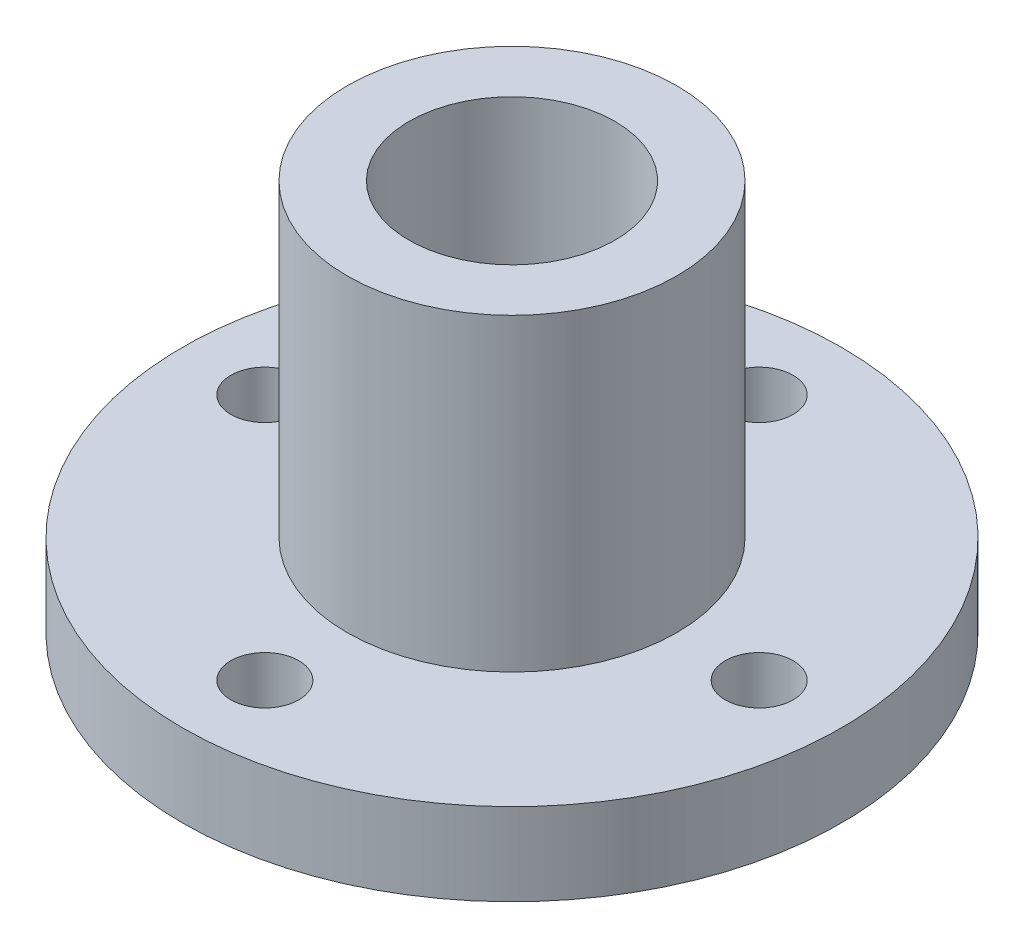
ISO-10303-21;
HEADER;
FILE_DESCRIPTION(('STEP AP214'),'2;1');
FILE_NAME('part.step','',(''),(''),'','','');
FILE_SCHEMA(('AUTOMOTIVE_DESIGN { 1 0 10303 214 1 1 1 1 }'));
ENDSEC;
DATA;
#1=APPLICATION_CONTEXT('core data for automotive mechanical design processes');
#2=APPLICATION_PROTOCOL_DEFINITION('international standard','automotive_design',2000,#1);
#3=PRODUCT_CONTEXT('',#1,'mechanical');
#4=PRODUCT('Part','Part','',(#3));
#5=PRODUCT_RELATED_PRODUCT_CATEGORY('part','',(#4));
#6=PRODUCT_DEFINITION_FORMATION('','',#4);
#7=PRODUCT_DEFINITION_CONTEXT('part definition',#1,'design');
#8=PRODUCT_DEFINITION('design','',#6,#7);
#9=PRODUCT_DEFINITION_SHAPE('','',#8);
#10=(LENGTH_UNIT() NAMED_UNIT(*) SI_UNIT(.MILLI.,.METRE.));
#11=(NAMED_UNIT(*) PLANE_ANGLE_UNIT() SI_UNIT($,.RADIAN.));
#12=(NAMED_UNIT(*) SI_UNIT($,.STERADIAN.) SOLID_ANGLE_UNIT());
#13=UNCERTAINTY_MEASURE_WITH_UNIT(LENGTH_MEASURE(1.E-05),#10,'distance_accuracy_value','');
#14=(GEOMETRIC_REPRESENTATION_CONTEXT(3) GLOBAL_UNCERTAINTY_ASSIGNED_CONTEXT((#13)) GLOBAL_UNIT_ASSIGNED_CONTEXT((#10,
#11,#12)) REPRESENTATION_CONTEXT('',''));
#15=CARTESIAN_POINT('',(0.,0.,0.));
#16=DIRECTION('',(0.,0.,1.));
#17=DIRECTION('',(1.,0.,0.));
#18=AXIS2_PLACEMENT_3D('',#15,#16,#17);
#19=CARTESIAN_POINT('',(-16.,0.,0.));
#20=DIRECTION('',(0.,1.,0.));
#21=DIRECTION('',(0.,0.,1.));
#22=AXIS2_PLACEMENT_3D('',#19,#20,#21);
#23=PLANE('',#22);
#24=CARTESIAN_POINT('',(12.,0.,0.));
#25=DIRECTION('',(0.,-1.,0.));
#26=DIRECTION('',(0.,0.,-1.));
#27=AXIS2_PLACEMENT_3D('',#24,#25,#26);
#28=CIRCLE('',#27,1.65);
#29=CARTESIAN_POINT('',(12.,0.,-1.65));
#30=VERTEX_POINT('',#29);
#31=EDGE_CURVE('E76',#30,#30,#28,.T.);
#32=ORIENTED_EDGE('',*,*,#31,.F.);
#33=EDGE_LOOP('',(#32));
#34=FACE_BOUND('',#33,.T.);
#35=CARTESIAN_POINT('',(0.,0.,-12.));
#36=DIRECTION('',(0.,-1.,0.));
#37=DIRECTION('',(0.,0.,-1.));
#38=AXIS2_PLACEMENT_3D('',#35,#36,#37);
#39=CIRCLE('',#38,1.65);
#40=CARTESIAN_POINT('',(0.,0.,-13.65));
#41=VERTEX_POINT('',#40);
#42=EDGE_CURVE('E63',#41,#41,#39,.T.);
#43=ORIENTED_EDGE('',*,*,#42,.F.);
#44=EDGE_LOOP('',(#43));
#45=FACE_BOUND('',#44,.T.);
#46=CARTESIAN_POINT('',(-12.,0.,0.));
#47=DIRECTION('',(0.,-1.,0.));
#48=DIRECTION('',(0.,0.,-1.));
#49=AXIS2_PLACEMENT_3D('',#46,#47,#48);
#50=CIRCLE('',#49,1.65);
#51=CARTESIAN_POINT('',(-12.,0.,-1.65));
#52=VERTEX_POINT('',#51);
#53=EDGE_CURVE('E59',#52,#52,#50,.T.);
#54=ORIENTED_EDGE('',*,*,#53,.F.);
#55=EDGE_LOOP('',(#54));
#56=FACE_BOUND('',#55,.T.);
#57=CARTESIAN_POINT('',(0.,0.,12.));
#58=DIRECTION('',(0.,-1.,0.));
#59=DIRECTION('',(0.,0.,-1.));
#60=AXIS2_PLACEMENT_3D('',#57,#58,#59);
#61=CIRCLE('',#60,1.65);
#62=CARTESIAN_POINT('',(0.,0.,10.35));
#63=VERTEX_POINT('',#62);
#64=EDGE_CURVE('E58',#63,#63,#61,.T.);
#65=ORIENTED_EDGE('',*,*,#64,.F.);
#66=EDGE_LOOP('',(#65));
#67=FACE_BOUND('',#66,.T.);
#68=CARTESIAN_POINT('',(0.,0.,0.));
#69=DIRECTION('',(0.,-1.,0.));
#70=DIRECTION('',(0.,0.,-1.));
#71=AXIS2_PLACEMENT_3D('',#68,#69,#70);
#72=CIRCLE('',#71,5.);
#73=CARTESIAN_POINT('',(0.,0.,-5.));
#74=VERTEX_POINT('',#73);
#75=EDGE_CURVE('E10',#74,#74,#72,.T.);
#76=ORIENTED_EDGE('',*,*,#75,.F.);
#77=EDGE_LOOP('',(#76));
#78=FACE_BOUND('',#77,.T.);
#79=CARTESIAN_POINT('',(0.,0.,0.));
#80=DIRECTION('',(0.,-1.,0.));
#81=DIRECTION('',(0.,0.,-1.));
#82=AXIS2_PLACEMENT_3D('',#79,#80,#81);
#83=CIRCLE('',#82,16.);
#84=CARTESIAN_POINT('',(0.,0.,-16.));
#85=VERTEX_POINT('',#84);
#86=EDGE_CURVE('E86',#85,#85,#83,.T.);
#87=ORIENTED_EDGE('',*,*,#86,.T.);
#88=EDGE_LOOP('',(#87));
#89=FACE_BOUND('',#88,.T.);
#90=ADVANCED_FACE('F37',(#34,#45,#56,#67,#78,#89),#23,.F.);
#91=CARTESIAN_POINT('',(0.,0.,0.));
#92=DIRECTION('',(0.,-1.,0.));
#93=DIRECTION('',(0.,0.,-1.));
#94=AXIS2_PLACEMENT_3D('',#91,#92,#93);
#95=CYLINDRICAL_SURFACE('',#94,5.);
#96=CARTESIAN_POINT('',(0.,19.,0.));
#97=DIRECTION('',(0.,-1.,0.));
#98=DIRECTION('',(0.,0.,-1.));
#99=AXIS2_PLACEMENT_3D('',#96,#97,#98);
#100=CIRCLE('',#99,5.);
#101=CARTESIAN_POINT('',(0.,19.,-5.));
#102=VERTEX_POINT('',#101);
#103=EDGE_CURVE('E45',#102,#102,#100,.T.);
#104=ORIENTED_EDGE('',*,*,#103,.F.);
#105=EDGE_LOOP('',(#104));
#106=FACE_BOUND('',#105,.T.);
#107=ORIENTED_EDGE('',*,*,#75,.T.);
#108=EDGE_LOOP('',(#107));
#109=FACE_BOUND('',#108,.T.);
#110=ADVANCED_FACE('F106',(#106,#109),#95,.F.);
#111=CARTESIAN_POINT('',(-5.,19.,0.));
#112=DIRECTION('',(0.,-1.,0.));
#113=DIRECTION('',(0.,0.,-1.));
#114=AXIS2_PLACEMENT_3D('',#111,#112,#113);
#115=PLANE('',#114);
#116=CARTESIAN_POINT('',(0.,19.,0.));
#117=DIRECTION('',(0.,-1.,0.));
#118=DIRECTION('',(0.,0.,-1.));
#119=AXIS2_PLACEMENT_3D('',#116,#117,#118);
#120=CIRCLE('',#119,8.);
#121=CARTESIAN_POINT('',(0.,19.,-8.));
#122=VERTEX_POINT('',#121);
#123=EDGE_CURVE('E51',#122,#122,#120,.T.);
#124=ORIENTED_EDGE('',*,*,#123,.F.);
#125=EDGE_LOOP('',(#124));
#126=FACE_BOUND('',#125,.T.);
#127=ORIENTED_EDGE('',*,*,#103,.T.);
#128=EDGE_LOOP('',(#127));
#129=FACE_BOUND('',#128,.T.);
#130=ADVANCED_FACE('F103',(#126,#129),#115,.F.);
#131=CARTESIAN_POINT('',(0.,0.,0.));
#132=DIRECTION('',(0.,-1.,0.));
#133=DIRECTION('',(0.,0.,-1.));
#134=AXIS2_PLACEMENT_3D('',#131,#132,#133);
#135=CYLINDRICAL_SURFACE('',#134,8.);
#136=CARTESIAN_POINT('',(0.,4.,0.));
#137=DIRECTION('',(0.,-1.,0.));
#138=DIRECTION('',(0.,0.,-1.));
#139=AXIS2_PLACEMENT_3D('',#136,#137,#138);
#140=CIRCLE('',#139,8.);
#141=CARTESIAN_POINT('',(0.,4.,-8.));
#142=VERTEX_POINT('',#141);
#143=EDGE_CURVE('E94',#142,#142,#140,.T.);
#144=ORIENTED_EDGE('',*,*,#143,.F.);
#145=EDGE_LOOP('',(#144));
#146=FACE_BOUND('',#145,.T.);
#147=ORIENTED_EDGE('',*,*,#123,.T.);
#148=EDGE_LOOP('',(#147));
#149=FACE_BOUND('',#148,.T.);
#150=ADVANCED_FACE('F101',(#146,#149),#135,.T.);
#151=CARTESIAN_POINT('',(-8.,4.,0.));
#152=DIRECTION('',(0.,-1.,0.));
#153=DIRECTION('',(0.,0.,-1.));
#154=AXIS2_PLACEMENT_3D('',#151,#152,#153);
#155=PLANE('',#154);
#156=CARTESIAN_POINT('',(12.,4.,0.));
#157=DIRECTION('',(0.,-1.,0.));
#158=DIRECTION('',(0.,0.,-1.));
#159=AXIS2_PLACEMENT_3D('',#156,#157,#158);
#160=CIRCLE('',#159,1.65);
#161=CARTESIAN_POINT('',(12.,4.,-1.65));
#162=VERTEX_POINT('',#161);
#163=EDGE_CURVE('E40',#162,#162,#160,.T.);
#164=ORIENTED_EDGE('',*,*,#163,.T.);
#165=EDGE_LOOP('',(#164));
#166=FACE_BOUND('',#165,.T.);
#167=CARTESIAN_POINT('',(0.,4.,-12.));
#168=DIRECTION('',(0.,-1.,0.));
#169=DIRECTION('',(0.,0.,-1.));
#170=AXIS2_PLACEMENT_3D('',#167,#168,#169);
#171=CIRCLE('',#170,1.65);
#172=CARTESIAN_POINT('',(0.,4.,-13.65));
#173=VERTEX_POINT('',#172);
#174=EDGE_CURVE('E60',#173,#173,#171,.T.);
#175=ORIENTED_EDGE('',*,*,#174,.T.);
#176=EDGE_LOOP('',(#175));
#177=FACE_BOUND('',#176,.T.);
#178=CARTESIAN_POINT('',(-12.,4.,0.));
#179=DIRECTION('',(0.,-1.,0.));
#180=DIRECTION('',(0.,0.,-1.));
#181=AXIS2_PLACEMENT_3D('',#178,#179,#180);
#182=CIRCLE('',#181,1.65);
#183=CARTESIAN_POINT('',(-12.,4.,-1.65));
#184=VERTEX_POINT('',#183);
#185=EDGE_CURVE('E55',#184,#184,#182,.T.);
#186=ORIENTED_EDGE('',*,*,#185,.T.);
#187=EDGE_LOOP('',(#186));
#188=FACE_BOUND('',#187,.T.);
#189=CARTESIAN_POINT('',(0.,4.,12.));
#190=DIRECTION('',(0.,-1.,0.));
#191=DIRECTION('',(0.,0.,-1.));
#192=AXIS2_PLACEMENT_3D('',#189,#190,#191);
#193=CIRCLE('',#192,1.65);
#194=CARTESIAN_POINT('',(0.,4.,10.35));
#195=VERTEX_POINT('',#194);
#196=EDGE_CURVE('E82',#195,#195,#193,.T.);
#197=ORIENTED_EDGE('',*,*,#196,.T.);
#198=EDGE_LOOP('',(#197));
#199=FACE_BOUND('',#198,.T.);
#200=CARTESIAN_POINT('',(0.,4.,0.));
#201=DIRECTION('',(0.,-1.,0.));
#202=DIRECTION('',(0.,0.,-1.));
#203=AXIS2_PLACEMENT_3D('',#200,#201,#202);
#204=CIRCLE('',#203,16.);
#205=CARTESIAN_POINT('',(0.,4.,-16.));
#206=VERTEX_POINT('',#205);
#207=EDGE_CURVE('E90',#206,#206,#204,.T.);
#208=ORIENTED_EDGE('',*,*,#207,.F.);
#209=EDGE_LOOP('',(#208));
#210=FACE_BOUND('',#209,.T.);
#211=ORIENTED_EDGE('',*,*,#143,.T.);
#212=EDGE_LOOP('',(#211));
#213=FACE_BOUND('',#212,.T.);
#214=ADVANCED_FACE('F118',(#166,#177,#188,#199,#210,#213),#155,.F.);
#215=CARTESIAN_POINT('',(0.,0.,0.));
#216=DIRECTION('',(0.,-1.,0.));
#217=DIRECTION('',(0.,0.,-1.));
#218=AXIS2_PLACEMENT_3D('',#215,#216,#217);
#219=CYLINDRICAL_SURFACE('',#218,16.);
#220=ORIENTED_EDGE('',*,*,#86,.F.);
#221=EDGE_LOOP('',(#220));
#222=FACE_BOUND('',#221,.T.);
#223=ORIENTED_EDGE('',*,*,#207,.T.);
#224=EDGE_LOOP('',(#223));
#225=FACE_BOUND('',#224,.T.);
#226=ADVANCED_FACE('F122',(#222,#225),#219,.T.);
#227=CARTESIAN_POINT('',(0.,0.,12.));
#228=DIRECTION('',(0.,-1.,0.));
#229=DIRECTION('',(0.,0.,-1.));
#230=AXIS2_PLACEMENT_3D('',#227,#228,#229);
#231=CYLINDRICAL_SURFACE('',#230,1.65);
#232=ORIENTED_EDGE('',*,*,#64,.T.);
#233=EDGE_LOOP('',(#232));
#234=FACE_BOUND('',#233,.T.);
#235=ORIENTED_EDGE('',*,*,#196,.F.);
#236=EDGE_LOOP('',(#235));
#237=FACE_BOUND('',#236,.T.);
#238=ADVANCED_FACE('F126',(#234,#237),#231,.F.);
#239=CARTESIAN_POINT('',(-12.,0.,0.));
#240=DIRECTION('',(0.,-1.,0.));
#241=DIRECTION('',(0.,0.,-1.));
#242=AXIS2_PLACEMENT_3D('',#239,#240,#241);
#243=CYLINDRICAL_SURFACE('',#242,1.65);
#244=ORIENTED_EDGE('',*,*,#53,.T.);
#245=EDGE_LOOP('',(#244));
#246=FACE_BOUND('',#245,.T.);
#247=ORIENTED_EDGE('',*,*,#185,.F.);
#248=EDGE_LOOP('',(#247));
#249=FACE_BOUND('',#248,.T.);
#250=ADVANCED_FACE('F130',(#246,#249),#243,.F.);
#251=CARTESIAN_POINT('',(0.,0.,-12.));
#252=DIRECTION('',(0.,-1.,0.));
#253=DIRECTION('',(0.,0.,-1.));
#254=AXIS2_PLACEMENT_3D('',#251,#252,#253);
#255=CYLINDRICAL_SURFACE('',#254,1.65);
#256=ORIENTED_EDGE('',*,*,#42,.T.);
#257=EDGE_LOOP('',(#256));
#258=FACE_BOUND('',#257,.T.);
#259=ORIENTED_EDGE('',*,*,#174,.F.);
#260=EDGE_LOOP('',(#259));
#261=FACE_BOUND('',#260,.T.);
#262=ADVANCED_FACE('F134',(#258,#261),#255,.F.);
#263=CARTESIAN_POINT('',(12.,0.,0.));
#264=DIRECTION('',(0.,-1.,0.));
#265=DIRECTION('',(0.,0.,-1.));
#266=AXIS2_PLACEMENT_3D('',#263,#264,#265);
#267=CYLINDRICAL_SURFACE('',#266,1.65);
#268=ORIENTED_EDGE('',*,*,#31,.T.);
#269=EDGE_LOOP('',(#268));
#270=FACE_BOUND('',#269,.T.);
#271=ORIENTED_EDGE('',*,*,#163,.F.);
#272=EDGE_LOOP('',(#271));
#273=FACE_BOUND('',#272,.T.);
#274=ADVANCED_FACE('F138',(#270,#273),#267,.F.);
#275=CLOSED_SHELL('',(#90,#110,#130,#150,#214,#226,#238,#250,#262,#274));
#276=MANIFOLD_SOLID_BREP('B2',#275);
#277=ADVANCED_BREP_SHAPE_REPRESENTATION('',(#18,#276),#14);
#278=SHAPE_DEFINITION_REPRESENTATION(#9,#277);
ENDSEC;
END-ISO-10303-21;
